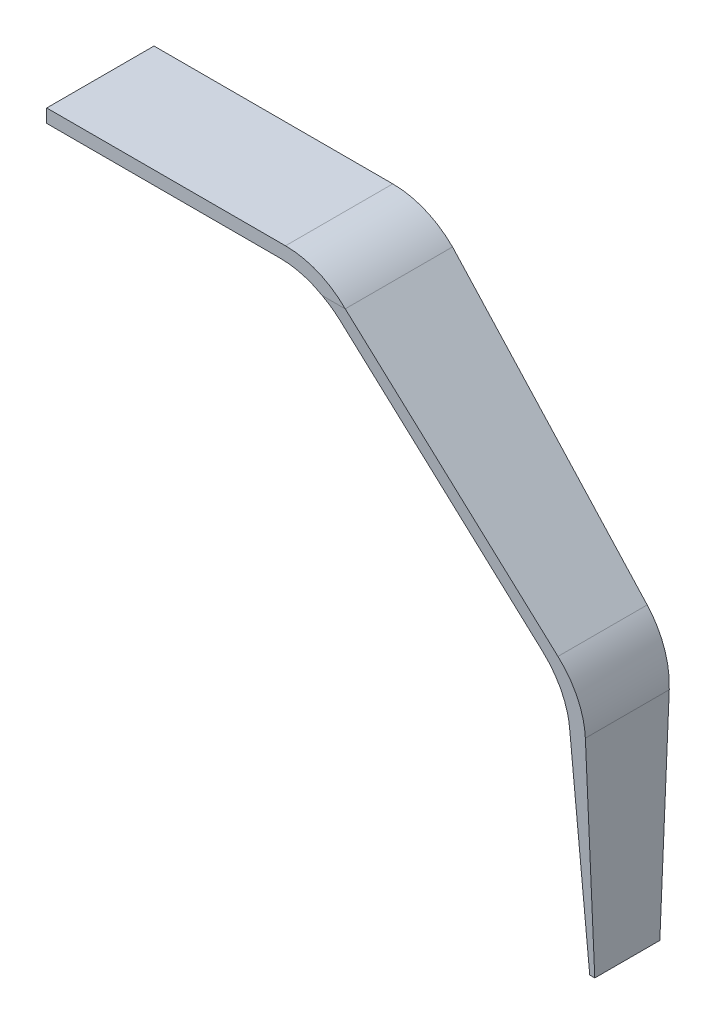
ISO-10303-21;
HEADER;
FILE_DESCRIPTION(('STEP AP214'),'2;1');
FILE_NAME('part.step','',(''),(''),'','','');
FILE_SCHEMA(('AUTOMOTIVE_DESIGN { 1 0 10303 214 1 1 1 1 }'));
ENDSEC;
DATA;
#1=APPLICATION_CONTEXT('core data for automotive mechanical design processes');
#2=APPLICATION_PROTOCOL_DEFINITION('international standard','automotive_design',2000,#1);
#3=PRODUCT_CONTEXT('',#1,'mechanical');
#4=PRODUCT('Part','Part','',(#3));
#5=PRODUCT_RELATED_PRODUCT_CATEGORY('part','',(#4));
#6=PRODUCT_DEFINITION_FORMATION('','',#4);
#7=PRODUCT_DEFINITION_CONTEXT('part definition',#1,'design');
#8=PRODUCT_DEFINITION('design','',#6,#7);
#9=PRODUCT_DEFINITION_SHAPE('','',#8);
#10=(LENGTH_UNIT() NAMED_UNIT(*) SI_UNIT(.MILLI.,.METRE.));
#11=(NAMED_UNIT(*) PLANE_ANGLE_UNIT() SI_UNIT($,.RADIAN.));
#12=(NAMED_UNIT(*) SI_UNIT($,.STERADIAN.) SOLID_ANGLE_UNIT());
#13=UNCERTAINTY_MEASURE_WITH_UNIT(LENGTH_MEASURE(1.E-05),#10,'distance_accuracy_value','');
#14=(GEOMETRIC_REPRESENTATION_CONTEXT(3) GLOBAL_UNCERTAINTY_ASSIGNED_CONTEXT((#13)) GLOBAL_UNIT_ASSIGNED_CONTEXT((#10,
#11,#12)) REPRESENTATION_CONTEXT('',''));
#15=CARTESIAN_POINT('',(0.,0.,0.));
#16=DIRECTION('',(0.,0.,1.));
#17=DIRECTION('',(1.,0.,0.));
#18=AXIS2_PLACEMENT_3D('',#15,#16,#17);
#19=CARTESIAN_POINT('',(-8.28427124746193,37.15,25.4));
#20=DIRECTION('',(0.,0.,-1.));
#21=DIRECTION('',(-1.,0.,0.));
#22=AXIS2_PLACEMENT_3D('',#19,#20,#21);
#23=CYLINDRICAL_SURFACE('',#22,20.);
#24=CARTESIAN_POINT('',(-8.28427124746193,37.15,0.768562018956066));
#25=DIRECTION('',(0.,0.0443379450207909,0.999016589767824));
#26=DIRECTION('',(0.,0.999016589767824,-0.0443379450207909));
#27=AXIS2_PLACEMENT_3D('',#24,#25,#26);
#28=ELLIPSE('',#27,20.019687565597,20.);
#29=CARTESIAN_POINT('',(5.85786437626908,51.2921356237309,0.140911549300429));
#30=VERTEX_POINT('',#29);
#31=CARTESIAN_POINT('',(1.7215677373163,54.467135623731,0.));
#32=VERTEX_POINT('',#31);
#33=EDGE_CURVE('E49',#30,#32,#28,.T.);
#34=ORIENTED_EDGE('',*,*,#33,.F.);
#35=DIRECTION('',(0.,0.,-1.));
#36=VECTOR('',#35,1.);
#37=CARTESIAN_POINT('',(5.85786437626908,51.2921356237309,25.4));
#38=LINE('',#37,#36);
#39=CARTESIAN_POINT('',(5.85786437626908,51.2921356237309,25.2590884506996));
#40=VERTEX_POINT('',#39);
#41=EDGE_CURVE('E161',#40,#30,#38,.T.);
#42=ORIENTED_EDGE('',*,*,#41,.F.);
#43=CARTESIAN_POINT('',(-8.28427124746193,37.15,24.6314379810439));
#44=DIRECTION('',(0.,0.0443379450207909,-0.999016589767824));
#45=DIRECTION('',(0.,-0.999016589767824,-0.0443379450207909));
#46=AXIS2_PLACEMENT_3D('',#43,#44,#45);
#47=ELLIPSE('',#46,20.019687565597,20.);
#48=CARTESIAN_POINT('',(1.72156773731627,54.467135623731,25.4));
#49=VERTEX_POINT('',#48);
#50=EDGE_CURVE('E128',#49,#40,#47,.T.);
#51=ORIENTED_EDGE('',*,*,#50,.F.);
#52=CARTESIAN_POINT('',(-8.28427124746193,37.15,25.4));
#53=DIRECTION('',(0.,0.,1.));
#54=DIRECTION('',(1.,0.,0.));
#55=AXIS2_PLACEMENT_3D('',#52,#53,#54);
#56=CIRCLE('',#55,20.);
#57=CARTESIAN_POINT('',(-8.28427124746201,57.15,25.4));
#58=VERTEX_POINT('',#57);
#59=EDGE_CURVE('E57',#49,#58,#56,.T.);
#60=ORIENTED_EDGE('',*,*,#59,.T.);
#61=DIRECTION('',(0.,0.,-1.));
#62=VECTOR('',#61,1.);
#63=CARTESIAN_POINT('',(-8.28427124746201,57.15,25.4));
#64=LINE('',#63,#62);
#65=CARTESIAN_POINT('',(-8.28427124746201,57.15,0.));
#66=VERTEX_POINT('',#65);
#67=EDGE_CURVE('E122',#58,#66,#64,.T.);
#68=ORIENTED_EDGE('',*,*,#67,.T.);
#69=CARTESIAN_POINT('',(-8.28427124746193,37.15,0.));
#70=DIRECTION('',(0.,0.,1.));
#71=DIRECTION('',(1.,0.,0.));
#72=AXIS2_PLACEMENT_3D('',#69,#70,#71);
#73=CIRCLE('',#72,20.);
#74=EDGE_CURVE('E79',#32,#66,#73,.T.);
#75=ORIENTED_EDGE('',*,*,#74,.F.);
#76=EDGE_LOOP('',(#34,#42,#51,#60,#68,#75));
#77=FACE_BOUND('',#76,.T.);
#78=ADVANCED_FACE('F35',(#77),#23,.F.);
#79=CARTESIAN_POINT('',(28.575,28.575,25.4));
#80=DIRECTION('',(0.707106781186548,0.707106781186548,0.));
#81=DIRECTION('',(-0.707106781186548,0.707106781186548,0.));
#82=AXIS2_PLACEMENT_3D('',#79,#80,#81);
#83=PLANE('',#82);
#84=ORIENTED_EDGE('',*,*,#41,.T.);
#85=DIRECTION('',(0.70675883659853,-0.70675883659853,0.0313670811486189));
#86=VECTOR('',#85,1.);
#87=CARTESIAN_POINT('',(29.1126165180287,28.0373834819712,1.17299443210129));
#88=LINE('',#87,#86);
#89=CARTESIAN_POINT('',(51.7018505372807,5.44814946271931,2.17554056223126));
#90=VERTEX_POINT('',#89);
#91=EDGE_CURVE('E195',#30,#90,#88,.T.);
#92=ORIENTED_EDGE('',*,*,#91,.T.);
#93=DIRECTION('',(0.,0.,-1.));
#94=VECTOR('',#93,1.);
#95=CARTESIAN_POINT('',(51.7018505372807,5.44814946271931,25.4));
#96=LINE('',#95,#94);
#97=CARTESIAN_POINT('',(51.7018505372807,5.44814946271931,23.2244594377687));
#98=VERTEX_POINT('',#97);
#99=EDGE_CURVE('E158',#98,#90,#96,.T.);
#100=ORIENTED_EDGE('',*,*,#99,.F.);
#101=DIRECTION('',(-0.70675883659853,0.70675883659853,0.0313670811486189));
#102=VECTOR('',#101,1.);
#103=CARTESIAN_POINT('',(28.5495248888145,28.6004751111855,24.2519964699052));
#104=LINE('',#103,#102);
#105=EDGE_CURVE('E173',#98,#40,#104,.T.);
#106=ORIENTED_EDGE('',*,*,#105,.T.);
#107=EDGE_LOOP('',(#84,#92,#100,#106));
#108=FACE_BOUND('',#107,.T.);
#109=ADVANCED_FACE('F268',(#108),#83,.F.);
#110=CARTESIAN_POINT('',(37.5597149135498,-8.6939861610117,25.4));
#111=DIRECTION('',(0.,0.,-1.));
#112=DIRECTION('',(-1.,0.,0.));
#113=AXIS2_PLACEMENT_3D('',#110,#111,#112);
#114=CYLINDRICAL_SURFACE('',#113,20.);
#115=ORIENTED_EDGE('',*,*,#99,.T.);
#116=CARTESIAN_POINT('',(37.5597149135498,-8.6939861610117,2.8031910318869));
#117=DIRECTION('',(0.,0.0443379450207909,0.999016589767824));
#118=DIRECTION('',(0.,0.999016589767824,-0.0443379450207909));
#119=AXIS2_PLACEMENT_3D('',#116,#117,#118);
#120=ELLIPSE('',#119,20.019687565597,20.);
#121=CARTESIAN_POINT('',(57.5347616911067,-7.69523382213393,2.75886481474086));
#122=VERTEX_POINT('',#121);
#123=EDGE_CURVE('E198',#90,#122,#120,.F.);
#124=ORIENTED_EDGE('',*,*,#123,.T.);
#125=DIRECTION('',(0.,0.,-1.));
#126=VECTOR('',#125,1.);
#127=CARTESIAN_POINT('',(57.5347616911067,-7.69523382213393,25.4));
#128=LINE('',#127,#126);
#129=CARTESIAN_POINT('',(57.5347616911067,-7.69523382213393,22.6411351852591));
#130=VERTEX_POINT('',#129);
#131=EDGE_CURVE('E155',#130,#122,#128,.T.);
#132=ORIENTED_EDGE('',*,*,#131,.F.);
#133=CARTESIAN_POINT('',(37.5597149135498,-8.6939861610117,22.5968089681131));
#134=DIRECTION('',(0.,0.0443379450207909,-0.999016589767824));
#135=DIRECTION('',(0.,-0.999016589767824,-0.0443379450207909));
#136=AXIS2_PLACEMENT_3D('',#133,#134,#135);
#137=ELLIPSE('',#136,20.019687565597,20.);
#138=EDGE_CURVE('E179',#130,#98,#137,.F.);
#139=ORIENTED_EDGE('',*,*,#138,.T.);
#140=EDGE_LOOP('',(#115,#124,#132,#139));
#141=FACE_BOUND('',#140,.T.);
#142=ADVANCED_FACE('F267',(#141),#114,.F.);
#143=CARTESIAN_POINT('',(57.0074812967581,2.85037406483791,25.4));
#144=DIRECTION('',(0.998752338877845,0.0499376169438923,0.));
#145=DIRECTION('',(-0.0499376169438923,0.998752338877845,0.));
#146=AXIS2_PLACEMENT_3D('',#143,#144,#145);
#147=PLANE('',#146);
#148=ORIENTED_EDGE('',*,*,#131,.T.);
#149=DIRECTION('',(0.0498886300670173,-0.997772601340345,0.0442827348360262));
#150=VECTOR('',#149,1.);
#151=CARTESIAN_POINT('',(57.0585341813659,1.82931637268186,2.336150129909));
#152=LINE('',#151,#150);
#153=CARTESIAN_POINT('',(60.0596094585622,-58.192189171246,5.));
#154=VERTEX_POINT('',#153);
#155=EDGE_CURVE('E201',#122,#154,#152,.T.);
#156=ORIENTED_EDGE('',*,*,#155,.T.);
#157=DIRECTION('',(0.,0.,-1.));
#158=VECTOR('',#157,1.);
#159=CARTESIAN_POINT('',(60.0596094585623,-58.192189171246,25.4));
#160=LINE('',#159,#158);
#161=CARTESIAN_POINT('',(60.0596094585622,-58.192189171246,20.4));
#162=VERTEX_POINT('',#161);
#163=EDGE_CURVE('E152',#162,#154,#160,.T.);
#164=ORIENTED_EDGE('',*,*,#163,.F.);
#165=DIRECTION('',(-0.0498886300670173,0.997772601340345,0.0442827348360262));
#166=VECTOR('',#165,1.);
#167=CARTESIAN_POINT('',(57.0024203749605,2.95159250078975,23.1136582694468));
#168=LINE('',#167,#166);
#169=EDGE_CURVE('E182',#162,#130,#168,.T.);
#170=ORIENTED_EDGE('',*,*,#169,.T.);
#171=EDGE_LOOP('',(#148,#156,#164,#170));
#172=FACE_BOUND('',#171,.T.);
#173=ADVANCED_FACE('F290',(#172),#147,.F.);
#174=CARTESIAN_POINT('',(0.,-58.192189171246,25.4));
#175=DIRECTION('',(0.,1.,0.));
#176=DIRECTION('',(0.,0.,1.));
#177=AXIS2_PLACEMENT_3D('',#174,#175,#176);
#178=PLANE('',#177);
#179=ORIENTED_EDGE('',*,*,#163,.T.);
#180=DIRECTION('',(1.,0.,0.));
#181=VECTOR('',#180,1.);
#182=CARTESIAN_POINT('',(-104.145064030267,-58.192189171246,5.));
#183=LINE('',#182,#181);
#184=CARTESIAN_POINT('',(61.2549359697327,-58.192189171246,5.));
#185=VERTEX_POINT('',#184);
#186=EDGE_CURVE('E210',#154,#185,#183,.T.);
#187=ORIENTED_EDGE('',*,*,#186,.T.);
#188=DIRECTION('',(0.,0.,-1.));
#189=VECTOR('',#188,1.);
#190=CARTESIAN_POINT('',(61.2549359697327,-58.192189171246,25.4));
#191=LINE('',#190,#189);
#192=CARTESIAN_POINT('',(61.2549359697327,-58.192189171246,20.4));
#193=VERTEX_POINT('',#192);
#194=EDGE_CURVE('E149',#193,#185,#191,.T.);
#195=ORIENTED_EDGE('',*,*,#194,.F.);
#196=DIRECTION('',(1.,0.,0.));
#197=VECTOR('',#196,1.);
#198=CARTESIAN_POINT('',(-104.145064030267,-58.192189171246,20.4));
#199=LINE('',#198,#197);
#200=EDGE_CURVE('E188',#162,#193,#199,.T.);
#201=ORIENTED_EDGE('',*,*,#200,.F.);
#202=EDGE_LOOP('',(#179,#187,#195,#201));
#203=FACE_BOUND('',#202,.T.);
#204=ADVANCED_FACE('F228',(#203),#178,.F.);
#205=CARTESIAN_POINT('',(61.2549359697327,0.,25.4));
#206=DIRECTION('',(-1.,0.,0.));
#207=DIRECTION('',(0.,0.,1.));
#208=AXIS2_PLACEMENT_3D('',#205,#206,#207);
#209=PLANE('',#208);
#210=ORIENTED_EDGE('',*,*,#194,.T.);
#211=DIRECTION('',(0.,-0.999016589767824,0.044337945020791));
#212=VECTOR('',#211,1.);
#213=CARTESIAN_POINT('',(61.2549359697327,54.467135623731,0.));
#214=LINE('',#213,#212);
#215=CARTESIAN_POINT('',(61.2549359697327,-7.89907915666004,2.76791179486865));
#216=VERTEX_POINT('',#215);
#217=EDGE_CURVE('E213',#216,#185,#214,.T.);
#218=ORIENTED_EDGE('',*,*,#217,.F.);
#219=DIRECTION('',(0.,0.,-1.));
#220=VECTOR('',#219,1.);
#221=CARTESIAN_POINT('',(61.2549359697327,-7.89907915666004,25.4));
#222=LINE('',#221,#220);
#223=CARTESIAN_POINT('',(61.2549359697327,-7.89907915666004,22.6320882051313));
#224=VERTEX_POINT('',#223);
#225=EDGE_CURVE('E146',#224,#216,#222,.T.);
#226=ORIENTED_EDGE('',*,*,#225,.F.);
#227=DIRECTION('',(0.,0.999016589767824,0.044337945020791));
#228=VECTOR('',#227,1.);
#229=CARTESIAN_POINT('',(61.2549359697327,54.467135623731,25.4));
#230=LINE('',#229,#228);
#231=EDGE_CURVE('E191',#193,#224,#230,.T.);
#232=ORIENTED_EDGE('',*,*,#231,.F.);
#233=EDGE_LOOP('',(#210,#218,#226,#232));
#234=FACE_BOUND('',#233,.T.);
#235=ADVANCED_FACE('F233',(#234),#209,.F.);
#236=CARTESIAN_POINT('',(41.2549359697327,-7.89907915666004,25.4));
#237=DIRECTION('',(0.,0.,-1.));
#238=DIRECTION('',(-1.,0.,0.));
#239=AXIS2_PLACEMENT_3D('',#236,#237,#238);
#240=CYLINDRICAL_SURFACE('',#239,20.);
#241=CARTESIAN_POINT('',(41.2549359697327,-7.89907915666004,2.76791179486865));
#242=DIRECTION('',(0.,0.0443379450207909,0.999016589767824));
#243=DIRECTION('',(0.,0.999016589767824,-0.0443379450207909));
#244=AXIS2_PLACEMENT_3D('',#241,#242,#243);
#245=ELLIPSE('',#244,20.019687565597,20.);
#246=CARTESIAN_POINT('',(55.3970715934636,6.24305646707092,2.14026132521301));
#247=VERTEX_POINT('',#246);
#248=EDGE_CURVE('E204',#247,#216,#245,.F.);
#249=ORIENTED_EDGE('',*,*,#248,.F.);
#250=DIRECTION('',(0.,0.,-1.));
#251=VECTOR('',#250,1.);
#252=CARTESIAN_POINT('',(55.3970715934636,6.24305646707092,25.4));
#253=LINE('',#252,#251);
#254=CARTESIAN_POINT('',(55.3970715934636,6.24305646707092,23.259738674787));
#255=VERTEX_POINT('',#254);
#256=EDGE_CURVE('E143',#255,#247,#253,.T.);
#257=ORIENTED_EDGE('',*,*,#256,.F.);
#258=CARTESIAN_POINT('',(41.2549359697327,-7.89907915666004,22.6320882051313));
#259=DIRECTION('',(0.,0.0443379450207909,-0.999016589767824));
#260=DIRECTION('',(0.,-0.999016589767824,-0.0443379450207909));
#261=AXIS2_PLACEMENT_3D('',#258,#259,#260);
#262=ELLIPSE('',#261,20.019687565597,20.);
#263=EDGE_CURVE('E185',#224,#255,#262,.F.);
#264=ORIENTED_EDGE('',*,*,#263,.F.);
#265=ORIENTED_EDGE('',*,*,#225,.T.);
#266=EDGE_LOOP('',(#249,#257,#264,#265));
#267=FACE_BOUND('',#266,.T.);
#268=ADVANCED_FACE('F242',(#267),#240,.T.);
#269=CARTESIAN_POINT('',(30.8200640302673,30.8200640302673,25.4));
#270=DIRECTION('',(0.707106781186548,0.707106781186548,0.));
#271=DIRECTION('',(-0.707106781186548,0.707106781186548,0.));
#272=AXIS2_PLACEMENT_3D('',#269,#270,#271);
#273=PLANE('',#272);
#274=DIRECTION('',(0.70675883659853,-0.70675883659853,0.0313670811486189));
#275=VECTOR('',#274,1.);
#276=CARTESIAN_POINT('',(31.3598894528306,30.2802386077039,1.07345295473959));
#277=LINE('',#276,#275);
#278=CARTESIAN_POINT('',(7.17299243680353,54.467135623731,0.));
#279=VERTEX_POINT('',#278);
#280=EDGE_CURVE('E207',#279,#247,#277,.T.);
#281=ORIENTED_EDGE('',*,*,#280,.F.);
#282=DIRECTION('',(0.,0.,-1.));
#283=VECTOR('',#282,1.);
#284=CARTESIAN_POINT('',(7.17299243680356,54.467135623731,25.4));
#285=LINE('',#284,#283);
#286=CARTESIAN_POINT('',(7.17299243680356,54.467135623731,25.4));
#287=VERTEX_POINT('',#286);
#288=EDGE_CURVE('E140',#287,#279,#285,.T.);
#289=ORIENTED_EDGE('',*,*,#288,.F.);
#290=DIRECTION('',(-0.70675883659853,0.70675883659853,0.0313670811486189));
#291=VECTOR('',#290,1.);
#292=CARTESIAN_POINT('',(30.7967978236164,30.8433302369182,24.3515379472669));
#293=LINE('',#292,#291);
#294=EDGE_CURVE('E87',#255,#287,#293,.T.);
#295=ORIENTED_EDGE('',*,*,#294,.F.);
#296=ORIENTED_EDGE('',*,*,#256,.T.);
#297=EDGE_LOOP('',(#281,#289,#295,#296));
#298=FACE_BOUND('',#297,.T.);
#299=ADVANCED_FACE('F248',(#298),#273,.T.);
#300=CARTESIAN_POINT('',(-6.96914318692738,40.325,25.4));
#301=DIRECTION('',(0.,0.,-1.));
#302=DIRECTION('',(-1.,0.,0.));
#303=AXIS2_PLACEMENT_3D('',#300,#301,#302);
#304=CYLINDRICAL_SURFACE('',#303,20.);
#305=CARTESIAN_POINT('',(-6.96914318692738,40.325,0.));
#306=DIRECTION('',(0.,0.,1.));
#307=DIRECTION('',(1.,0.,0.));
#308=AXIS2_PLACEMENT_3D('',#305,#306,#307);
#309=CIRCLE('',#308,20.);
#310=CARTESIAN_POINT('',(-6.96914318692738,60.325,0.));
#311=VERTEX_POINT('',#310);
#312=EDGE_CURVE('E127',#279,#311,#309,.T.);
#313=ORIENTED_EDGE('',*,*,#312,.T.);
#314=DIRECTION('',(0.,0.,-1.));
#315=VECTOR('',#314,1.);
#316=CARTESIAN_POINT('',(-6.96914318692738,60.325,25.4));
#317=LINE('',#316,#315);
#318=CARTESIAN_POINT('',(-6.96914318692738,60.325,25.4));
#319=VERTEX_POINT('',#318);
#320=EDGE_CURVE('E107',#319,#311,#317,.T.);
#321=ORIENTED_EDGE('',*,*,#320,.F.);
#322=CARTESIAN_POINT('',(-6.96914318692738,40.325,25.4));
#323=DIRECTION('',(0.,0.,1.));
#324=DIRECTION('',(1.,0.,0.));
#325=AXIS2_PLACEMENT_3D('',#322,#323,#324);
#326=CIRCLE('',#325,20.);
#327=EDGE_CURVE('E115',#287,#319,#326,.T.);
#328=ORIENTED_EDGE('',*,*,#327,.F.);
#329=ORIENTED_EDGE('',*,*,#288,.T.);
#330=EDGE_LOOP('',(#313,#321,#328,#329));
#331=FACE_BOUND('',#330,.T.);
#332=ADVANCED_FACE('F274',(#331),#304,.T.);
#333=CARTESIAN_POINT('',(0.,60.325,25.4));
#334=DIRECTION('',(0.,1.,0.));
#335=DIRECTION('',(-1.,0.,0.));
#336=AXIS2_PLACEMENT_3D('',#333,#334,#335);
#337=PLANE('',#336);
#338=DIRECTION('',(1.,0.,0.));
#339=VECTOR('',#338,1.);
#340=CARTESIAN_POINT('',(0.,60.325,0.));
#341=LINE('',#340,#339);
#342=CARTESIAN_POINT('',(-63.5,60.325,0.));
#343=VERTEX_POINT('',#342);
#344=EDGE_CURVE('E102',#343,#311,#341,.T.);
#345=ORIENTED_EDGE('',*,*,#344,.F.);
#346=DIRECTION('',(0.,0.,-1.));
#347=VECTOR('',#346,1.);
#348=CARTESIAN_POINT('',(-63.5,60.325,25.4));
#349=LINE('',#348,#347);
#350=CARTESIAN_POINT('',(-63.5,60.325,25.4));
#351=VERTEX_POINT('',#350);
#352=EDGE_CURVE('E97',#351,#343,#349,.T.);
#353=ORIENTED_EDGE('',*,*,#352,.F.);
#354=DIRECTION('',(1.,0.,0.));
#355=VECTOR('',#354,1.);
#356=CARTESIAN_POINT('',(0.,60.325,25.4));
#357=LINE('',#356,#355);
#358=EDGE_CURVE('E100',#351,#319,#357,.T.);
#359=ORIENTED_EDGE('',*,*,#358,.T.);
#360=ORIENTED_EDGE('',*,*,#320,.T.);
#361=EDGE_LOOP('',(#345,#353,#359,#360));
#362=FACE_BOUND('',#361,.T.);
#363=ADVANCED_FACE('F99',(#362),#337,.T.);
#364=CARTESIAN_POINT('',(-63.5,0.,25.4));
#365=DIRECTION('',(-1.,0.,0.));
#366=DIRECTION('',(0.,0.,1.));
#367=AXIS2_PLACEMENT_3D('',#364,#365,#366);
#368=PLANE('',#367);
#369=DIRECTION('',(0.,1.,0.));
#370=VECTOR('',#369,1.);
#371=CARTESIAN_POINT('',(-63.5,0.,0.));
#372=LINE('',#371,#370);
#373=CARTESIAN_POINT('',(-63.5,57.15,0.));
#374=VERTEX_POINT('',#373);
#375=EDGE_CURVE('E132',#374,#343,#372,.T.);
#376=ORIENTED_EDGE('',*,*,#375,.F.);
#377=DIRECTION('',(0.,0.,-1.));
#378=VECTOR('',#377,1.);
#379=CARTESIAN_POINT('',(-63.5,57.15,25.4));
#380=LINE('',#379,#378);
#381=CARTESIAN_POINT('',(-63.5,57.15,25.4));
#382=VERTEX_POINT('',#381);
#383=EDGE_CURVE('E108',#382,#374,#380,.T.);
#384=ORIENTED_EDGE('',*,*,#383,.F.);
#385=DIRECTION('',(0.,1.,0.));
#386=VECTOR('',#385,1.);
#387=CARTESIAN_POINT('',(-63.5,0.,25.4));
#388=LINE('',#387,#386);
#389=EDGE_CURVE('E113',#382,#351,#388,.T.);
#390=ORIENTED_EDGE('',*,*,#389,.T.);
#391=ORIENTED_EDGE('',*,*,#352,.T.);
#392=EDGE_LOOP('',(#376,#384,#390,#391));
#393=FACE_BOUND('',#392,.T.);
#394=ADVANCED_FACE('F118',(#393),#368,.T.);
#395=CARTESIAN_POINT('',(0.,57.15,25.4));
#396=DIRECTION('',(0.,1.,0.));
#397=DIRECTION('',(0.,0.,1.));
#398=AXIS2_PLACEMENT_3D('',#395,#396,#397);
#399=PLANE('',#398);
#400=DIRECTION('',(1.,0.,0.));
#401=VECTOR('',#400,1.);
#402=CARTESIAN_POINT('',(0.,57.15,0.));
#403=LINE('',#402,#401);
#404=EDGE_CURVE('E134',#374,#66,#403,.T.);
#405=ORIENTED_EDGE('',*,*,#404,.T.);
#406=ORIENTED_EDGE('',*,*,#67,.F.);
#407=DIRECTION('',(1.,0.,0.));
#408=VECTOR('',#407,1.);
#409=CARTESIAN_POINT('',(0.,57.15,25.4));
#410=LINE('',#409,#408);
#411=EDGE_CURVE('E120',#382,#58,#410,.T.);
#412=ORIENTED_EDGE('',*,*,#411,.F.);
#413=ORIENTED_EDGE('',*,*,#383,.T.);
#414=EDGE_LOOP('',(#405,#406,#412,#413));
#415=FACE_BOUND('',#414,.T.);
#416=ADVANCED_FACE('F270',(#415),#399,.F.);
#417=CARTESIAN_POINT('',(0.,0.,25.4));
#418=DIRECTION('',(0.,0.,1.));
#419=DIRECTION('',(1.,0.,0.));
#420=AXIS2_PLACEMENT_3D('',#417,#418,#419);
#421=PLANE('',#420);
#422=DIRECTION('',(-1.,0.,0.));
#423=VECTOR('',#422,1.);
#424=CARTESIAN_POINT('',(0.,54.467135623731,25.4));
#425=LINE('',#424,#423);
#426=EDGE_CURVE('E42',#287,#49,#425,.T.);
#427=ORIENTED_EDGE('',*,*,#426,.F.);
#428=ORIENTED_EDGE('',*,*,#327,.T.);
#429=ORIENTED_EDGE('',*,*,#358,.F.);
#430=ORIENTED_EDGE('',*,*,#389,.F.);
#431=ORIENTED_EDGE('',*,*,#411,.T.);
#432=ORIENTED_EDGE('',*,*,#59,.F.);
#433=EDGE_LOOP('',(#427,#428,#429,#430,#431,#432));
#434=FACE_BOUND('',#433,.T.);
#435=ADVANCED_FACE('F112',(#434),#421,.T.);
#436=CARTESIAN_POINT('',(0.,0.,0.));
#437=DIRECTION('',(0.,0.,1.));
#438=DIRECTION('',(1.,0.,0.));
#439=AXIS2_PLACEMENT_3D('',#436,#437,#438);
#440=PLANE('',#439);
#441=ORIENTED_EDGE('',*,*,#312,.F.);
#442=DIRECTION('',(-1.,0.,0.));
#443=VECTOR('',#442,1.);
#444=CARTESIAN_POINT('',(0.,54.467135623731,0.));
#445=LINE('',#444,#443);
#446=EDGE_CURVE('E11',#279,#32,#445,.T.);
#447=ORIENTED_EDGE('',*,*,#446,.T.);
#448=ORIENTED_EDGE('',*,*,#74,.T.);
#449=ORIENTED_EDGE('',*,*,#404,.F.);
#450=ORIENTED_EDGE('',*,*,#375,.T.);
#451=ORIENTED_EDGE('',*,*,#344,.T.);
#452=EDGE_LOOP('',(#441,#447,#448,#449,#450,#451));
#453=FACE_BOUND('',#452,.T.);
#454=ADVANCED_FACE('F272',(#453),#440,.F.);
#455=CARTESIAN_POINT('',(-104.145064030267,54.467135623731,25.4));
#456=DIRECTION('',(0.,0.0443379450207909,-0.999016589767824));
#457=DIRECTION('',(0.,0.999016589767824,0.044337945020791));
#458=AXIS2_PLACEMENT_3D('',#455,#456,#457);
#459=PLANE('',#458);
#460=ORIENTED_EDGE('',*,*,#50,.T.);
#461=ORIENTED_EDGE('',*,*,#105,.F.);
#462=ORIENTED_EDGE('',*,*,#138,.F.);
#463=ORIENTED_EDGE('',*,*,#169,.F.);
#464=ORIENTED_EDGE('',*,*,#200,.T.);
#465=ORIENTED_EDGE('',*,*,#231,.T.);
#466=ORIENTED_EDGE('',*,*,#263,.T.);
#467=ORIENTED_EDGE('',*,*,#294,.T.);
#468=ORIENTED_EDGE('',*,*,#426,.T.);
#469=EDGE_LOOP('',(#460,#461,#462,#463,#464,#465,#466,#467,#468));
#470=FACE_BOUND('',#469,.T.);
#471=ADVANCED_FACE('F165',(#470),#459,.F.);
#472=CARTESIAN_POINT('',(-104.145064030267,54.467135623731,0.));
#473=DIRECTION('',(0.,0.0443379450207909,0.999016589767824));
#474=DIRECTION('',(0.,-0.999016589767824,0.044337945020791));
#475=AXIS2_PLACEMENT_3D('',#472,#473,#474);
#476=PLANE('',#475);
#477=ORIENTED_EDGE('',*,*,#33,.T.);
#478=ORIENTED_EDGE('',*,*,#446,.F.);
#479=ORIENTED_EDGE('',*,*,#280,.T.);
#480=ORIENTED_EDGE('',*,*,#248,.T.);
#481=ORIENTED_EDGE('',*,*,#217,.T.);
#482=ORIENTED_EDGE('',*,*,#186,.F.);
#483=ORIENTED_EDGE('',*,*,#155,.F.);
#484=ORIENTED_EDGE('',*,*,#123,.F.);
#485=ORIENTED_EDGE('',*,*,#91,.F.);
#486=EDGE_LOOP('',(#477,#478,#479,#480,#481,#482,#483,#484,#485));
#487=FACE_BOUND('',#486,.T.);
#488=ADVANCED_FACE('F218',(#487),#476,.F.);
#489=CLOSED_SHELL('',(#78,#109,#142,#173,#204,#235,#268,#299,#332,#363,#394,#416,#435,#454,#471,#488));
#490=MANIFOLD_SOLID_BREP('B2',#489);
#491=ADVANCED_BREP_SHAPE_REPRESENTATION('',(#18,#490),#14);
#492=SHAPE_DEFINITION_REPRESENTATION(#9,#491);
ENDSEC;
END-ISO-10303-21;
